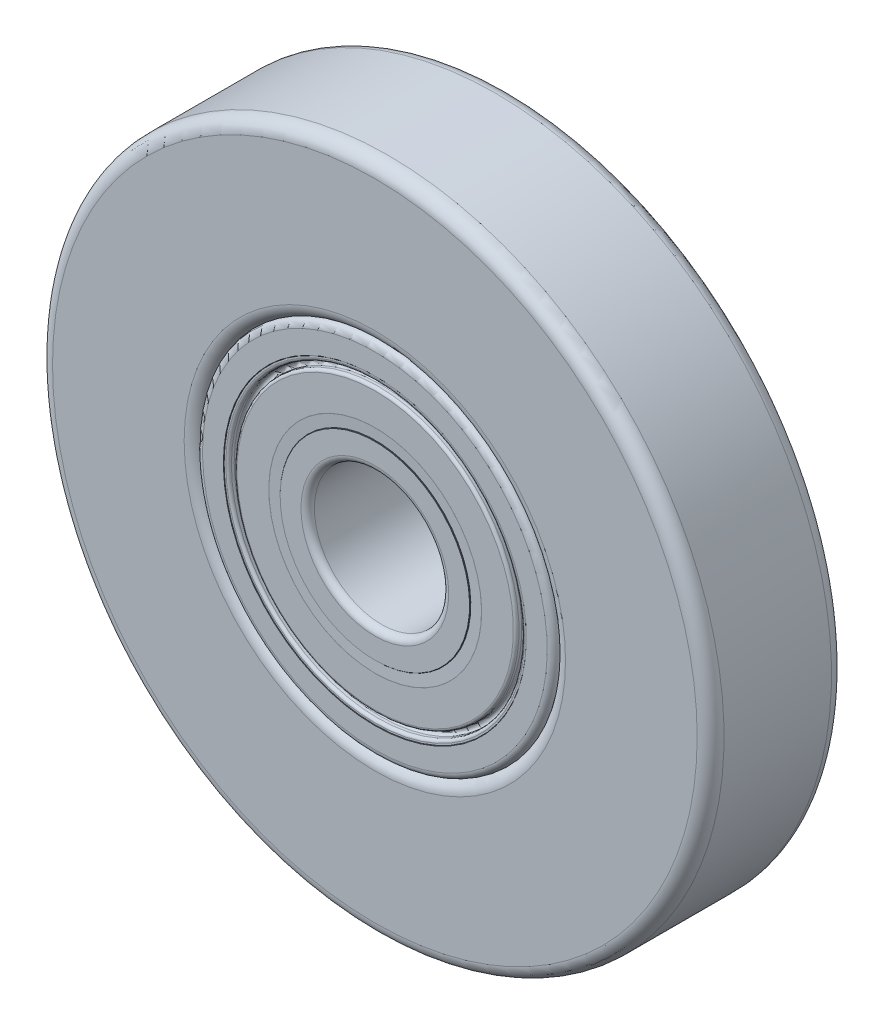
ISO-10303-21;
HEADER;
FILE_DESCRIPTION(('STEP AP214'),'2;1');
FILE_NAME('part.step','',(''),(''),'','','');
FILE_SCHEMA(('AUTOMOTIVE_DESIGN { 1 0 10303 214 1 1 1 1 }'));
ENDSEC;
DATA;
#1=APPLICATION_CONTEXT('core data for automotive mechanical design processes');
#2=APPLICATION_PROTOCOL_DEFINITION('international standard','automotive_design',2000,#1);
#3=PRODUCT_CONTEXT('',#1,'mechanical');
#4=PRODUCT('Part','Part','',(#3));
#5=PRODUCT_RELATED_PRODUCT_CATEGORY('part','',(#4));
#6=PRODUCT_DEFINITION_FORMATION('','',#4);
#7=PRODUCT_DEFINITION_CONTEXT('part definition',#1,'design');
#8=PRODUCT_DEFINITION('design','',#6,#7);
#9=PRODUCT_DEFINITION_SHAPE('','',#8);
#10=(LENGTH_UNIT() NAMED_UNIT(*) SI_UNIT(.MILLI.,.METRE.));
#11=(NAMED_UNIT(*) PLANE_ANGLE_UNIT() SI_UNIT($,.RADIAN.));
#12=(NAMED_UNIT(*) SI_UNIT($,.STERADIAN.) SOLID_ANGLE_UNIT());
#13=UNCERTAINTY_MEASURE_WITH_UNIT(LENGTH_MEASURE(1.E-05),#10,'distance_accuracy_value','');
#14=(GEOMETRIC_REPRESENTATION_CONTEXT(3) GLOBAL_UNCERTAINTY_ASSIGNED_CONTEXT((#13)) GLOBAL_UNIT_ASSIGNED_CONTEXT((#10,
#11,#12)) REPRESENTATION_CONTEXT('',''));
#15=CARTESIAN_POINT('',(0.,0.,0.));
#16=DIRECTION('',(0.,0.,1.));
#17=DIRECTION('',(1.,0.,0.));
#18=AXIS2_PLACEMENT_3D('',#15,#16,#17);
#19=CARTESIAN_POINT('',(0.,0.,8.89000000000002));
#20=DIRECTION('',(0.,0.,1.));
#21=DIRECTION('',(0.,-1.,0.));
#22=AXIS2_PLACEMENT_3D('',#19,#20,#21);
#23=CYLINDRICAL_SURFACE('',#22,2.12499999999995);
#24=CARTESIAN_POINT('',(0.,0.,1.492));
#25=DIRECTION('',(0.,0.,1.));
#26=DIRECTION('',(0.,-1.,0.));
#27=AXIS2_PLACEMENT_3D('',#24,#25,#26);
#28=CIRCLE('',#27,2.12499999999995);
#29=CARTESIAN_POINT('',(0.,-2.1249999999999,1.492));
#30=VERTEX_POINT('',#29);
#31=EDGE_CURVE('E69',#30,#30,#28,.T.);
#32=ORIENTED_EDGE('',*,*,#31,.F.);
#33=EDGE_LOOP('',(#32));
#34=FACE_BOUND('',#33,.T.);
#35=CARTESIAN_POINT('',(0.,0.,1.48102527812174));
#36=DIRECTION('',(0.,0.,1.));
#37=DIRECTION('',(0.,-1.,0.));
#38=AXIS2_PLACEMENT_3D('',#35,#36,#37);
#39=CIRCLE('',#38,2.12499999999995);
#40=CARTESIAN_POINT('',(0.,-2.1249999999999,1.48102527812174));
#41=VERTEX_POINT('',#40);
#42=EDGE_CURVE('E66',#41,#41,#39,.F.);
#43=ORIENTED_EDGE('',*,*,#42,.F.);
#44=EDGE_LOOP('',(#43));
#45=FACE_BOUND('',#44,.T.);
#46=ADVANCED_FACE('F43',(#34,#45),#23,.T.);
#47=CARTESIAN_POINT('',(0.,0.,-1.48102527812174));
#48=DIRECTION('',(0.,0.,1.));
#49=DIRECTION('',(0.,-1.,0.));
#50=AXIS2_PLACEMENT_3D('',#47,#48,#49);
#51=CIRCLE('',#50,2.12499999999995);
#52=CARTESIAN_POINT('',(0.,-2.1249999999999,-1.48102527812174));
#53=VERTEX_POINT('',#52);
#54=EDGE_CURVE('E144',#53,#53,#51,.T.);
#55=ORIENTED_EDGE('',*,*,#54,.F.);
#56=EDGE_LOOP('',(#55));
#57=FACE_BOUND('',#56,.T.);
#58=CARTESIAN_POINT('',(0.,0.,-1.492));
#59=DIRECTION('',(0.,0.,1.));
#60=DIRECTION('',(0.,-1.,0.));
#61=AXIS2_PLACEMENT_3D('',#58,#59,#60);
#62=CIRCLE('',#61,2.12499999999995);
#63=CARTESIAN_POINT('',(0.,-2.1249999999999,-1.492));
#64=VERTEX_POINT('',#63);
#65=EDGE_CURVE('E90',#64,#64,#62,.T.);
#66=ORIENTED_EDGE('',*,*,#65,.T.);
#67=EDGE_LOOP('',(#66));
#68=FACE_BOUND('',#67,.T.);
#69=ADVANCED_FACE('F193',(#57,#68),#23,.T.);
#70=CARTESIAN_POINT('',(0.,0.,1.492));
#71=DIRECTION('',(0.,0.,-1.));
#72=DIRECTION('',(0.,1.,0.));
#73=AXIS2_PLACEMENT_3D('',#70,#71,#72);
#74=CONICAL_SURFACE('',#73,2.12499999999995,0.785398163397503);
#75=CARTESIAN_POINT('',(0.,0.,1.5));
#76=DIRECTION('',(0.,0.,1.));
#77=DIRECTION('',(0.,-1.,0.));
#78=AXIS2_PLACEMENT_3D('',#75,#76,#77);
#79=CIRCLE('',#78,2.11699999999995);
#80=CARTESIAN_POINT('',(0.,-2.1169999999999,1.5));
#81=VERTEX_POINT('',#80);
#82=EDGE_CURVE('E72',#81,#81,#79,.T.);
#83=ORIENTED_EDGE('',*,*,#82,.F.);
#84=EDGE_LOOP('',(#83));
#85=FACE_BOUND('',#84,.T.);
#86=ORIENTED_EDGE('',*,*,#31,.T.);
#87=EDGE_LOOP('',(#86));
#88=FACE_BOUND('',#87,.T.);
#89=ADVANCED_FACE('F200',(#85,#88),#74,.T.);
#90=CARTESIAN_POINT('',(0.,2.117,1.5));
#91=DIRECTION('',(0.,0.,-1.));
#92=DIRECTION('',(0.,1.,0.));
#93=AXIS2_PLACEMENT_3D('',#90,#91,#92);
#94=PLANE('',#93);
#95=CARTESIAN_POINT('',(0.,0.,1.5));
#96=DIRECTION('',(0.,0.,1.));
#97=DIRECTION('',(0.,-1.,0.));
#98=AXIS2_PLACEMENT_3D('',#95,#96,#97);
#99=CIRCLE('',#98,1.64999999999995);
#100=CARTESIAN_POINT('',(0.,-1.64999999999991,1.5));
#101=VERTEX_POINT('',#100);
#102=EDGE_CURVE('E75',#101,#101,#99,.T.);
#103=ORIENTED_EDGE('',*,*,#102,.F.);
#104=EDGE_LOOP('',(#103));
#105=FACE_BOUND('',#104,.T.);
#106=ORIENTED_EDGE('',*,*,#82,.T.);
#107=EDGE_LOOP('',(#106));
#108=FACE_BOUND('',#107,.T.);
#109=ADVANCED_FACE('F319',(#105,#108),#94,.F.);
#110=CARTESIAN_POINT('',(0.,0.,1.35));
#111=DIRECTION('',(0.,0.,1.));
#112=DIRECTION('',(0.,-1.,0.));
#113=AXIS2_PLACEMENT_3D('',#110,#111,#112);
#114=TOROIDAL_SURFACE('',#113,1.64999999999995,0.150000000000001);
#115=CARTESIAN_POINT('',(0.,0.,1.35));
#116=DIRECTION('',(0.,0.,1.));
#117=DIRECTION('',(0.,-1.,0.));
#118=AXIS2_PLACEMENT_3D('',#115,#116,#117);
#119=CIRCLE('',#118,1.49999999999995);
#120=CARTESIAN_POINT('',(0.,-1.4999999999999,1.35));
#121=VERTEX_POINT('',#120);
#122=EDGE_CURVE('E78',#121,#121,#119,.T.);
#123=ORIENTED_EDGE('',*,*,#122,.F.);
#124=EDGE_LOOP('',(#123));
#125=FACE_BOUND('',#124,.T.);
#126=ORIENTED_EDGE('',*,*,#102,.T.);
#127=EDGE_LOOP('',(#126));
#128=FACE_BOUND('',#127,.T.);
#129=ADVANCED_FACE('F316',(#125,#128),#114,.T.);
#130=CARTESIAN_POINT('',(0.,0.,8.89000000000002));
#131=DIRECTION('',(0.,0.,1.));
#132=DIRECTION('',(0.,-1.,0.));
#133=AXIS2_PLACEMENT_3D('',#130,#131,#132);
#134=CYLINDRICAL_SURFACE('',#133,1.49999999999995);
#135=CARTESIAN_POINT('',(0.,0.,-1.35));
#136=DIRECTION('',(0.,0.,1.));
#137=DIRECTION('',(0.,-1.,0.));
#138=AXIS2_PLACEMENT_3D('',#135,#136,#137);
#139=CIRCLE('',#138,1.49999999999995);
#140=CARTESIAN_POINT('',(0.,-1.4999999999999,-1.35));
#141=VERTEX_POINT('',#140);
#142=EDGE_CURVE('E81',#141,#141,#139,.T.);
#143=ORIENTED_EDGE('',*,*,#142,.F.);
#144=EDGE_LOOP('',(#143));
#145=FACE_BOUND('',#144,.T.);
#146=ORIENTED_EDGE('',*,*,#122,.T.);
#147=EDGE_LOOP('',(#146));
#148=FACE_BOUND('',#147,.T.);
#149=ADVANCED_FACE('F312',(#145,#148),#134,.F.);
#150=CARTESIAN_POINT('',(0.,0.,-1.35));
#151=DIRECTION('',(0.,0.,1.));
#152=DIRECTION('',(0.,-1.,0.));
#153=AXIS2_PLACEMENT_3D('',#150,#151,#152);
#154=TOROIDAL_SURFACE('',#153,1.64999999999995,0.149999999999999);
#155=CARTESIAN_POINT('',(0.,0.,-1.5));
#156=DIRECTION('',(0.,0.,1.));
#157=DIRECTION('',(0.,-1.,0.));
#158=AXIS2_PLACEMENT_3D('',#155,#156,#157);
#159=CIRCLE('',#158,1.64999999999995);
#160=CARTESIAN_POINT('',(0.,-1.6499999999999,-1.5));
#161=VERTEX_POINT('',#160);
#162=EDGE_CURVE('E84',#161,#161,#159,.T.);
#163=ORIENTED_EDGE('',*,*,#162,.F.);
#164=EDGE_LOOP('',(#163));
#165=FACE_BOUND('',#164,.T.);
#166=ORIENTED_EDGE('',*,*,#142,.T.);
#167=EDGE_LOOP('',(#166));
#168=FACE_BOUND('',#167,.T.);
#169=ADVANCED_FACE('F308',(#165,#168),#154,.T.);
#170=CARTESIAN_POINT('',(0.,2.117,-1.5));
#171=DIRECTION('',(0.,0.,1.));
#172=DIRECTION('',(0.,-1.,0.));
#173=AXIS2_PLACEMENT_3D('',#170,#171,#172);
#174=PLANE('',#173);
#175=CARTESIAN_POINT('',(0.,0.,-1.5));
#176=DIRECTION('',(0.,0.,1.));
#177=DIRECTION('',(0.,-1.,0.));
#178=AXIS2_PLACEMENT_3D('',#175,#176,#177);
#179=CIRCLE('',#178,2.11699999999995);
#180=CARTESIAN_POINT('',(0.,-2.1169999999999,-1.5));
#181=VERTEX_POINT('',#180);
#182=EDGE_CURVE('E87',#181,#181,#179,.T.);
#183=ORIENTED_EDGE('',*,*,#182,.F.);
#184=EDGE_LOOP('',(#183));
#185=FACE_BOUND('',#184,.T.);
#186=ORIENTED_EDGE('',*,*,#162,.T.);
#187=EDGE_LOOP('',(#186));
#188=FACE_BOUND('',#187,.T.);
#189=ADVANCED_FACE('F304',(#185,#188),#174,.F.);
#190=CARTESIAN_POINT('',(0.,0.,-1.5));
#191=DIRECTION('',(0.,0.,1.));
#192=DIRECTION('',(0.,-1.,0.));
#193=AXIS2_PLACEMENT_3D('',#190,#191,#192);
#194=CONICAL_SURFACE('',#193,2.11699999999995,0.785398163397394);
#195=ORIENTED_EDGE('',*,*,#65,.F.);
#196=EDGE_LOOP('',(#195));
#197=FACE_BOUND('',#196,.T.);
#198=ORIENTED_EDGE('',*,*,#182,.T.);
#199=EDGE_LOOP('',(#198));
#200=FACE_BOUND('',#199,.T.);
#201=ADVANCED_FACE('F301',(#197,#200),#194,.T.);
#202=CARTESIAN_POINT('',(0.,0.,-1.49194051384887));
#203=DIRECTION('',(0.,0.,-1.));
#204=DIRECTION('',(0.,1.,0.));
#205=AXIS2_PLACEMENT_3D('',#202,#203,#204);
#206=CONICAL_SURFACE('',#205,2.37499999999995,1.52716309549504);
#207=ORIENTED_EDGE('',*,*,#54,.T.);
#208=EDGE_LOOP('',(#207));
#209=FACE_BOUND('',#208,.T.);
#210=CARTESIAN_POINT('',(0.,0.,-1.49194051384887));
#211=DIRECTION('',(0.,0.,1.));
#212=DIRECTION('',(0.,-1.,0.));
#213=AXIS2_PLACEMENT_3D('',#210,#211,#212);
#214=CIRCLE('',#213,2.37499999999995);
#215=CARTESIAN_POINT('',(0.,-2.3749999999999,-1.49194051384887));
#216=VERTEX_POINT('',#215);
#217=EDGE_CURVE('E93',#216,#216,#214,.T.);
#218=ORIENTED_EDGE('',*,*,#217,.F.);
#219=EDGE_LOOP('',(#218));
#220=FACE_BOUND('',#219,.T.);
#221=ADVANCED_FACE('F297',(#209,#220),#206,.F.);
#222=CARTESIAN_POINT('',(0.,0.,-1.4295));
#223=DIRECTION('',(0.,0.,1.));
#224=DIRECTION('',(0.,-1.,0.));
#225=AXIS2_PLACEMENT_3D('',#222,#223,#224);
#226=TOROIDAL_SURFACE('',#225,2.37772621171029,0.0625000000000003);
#227=CARTESIAN_POINT('',(0.,0.,-1.492));
#228=DIRECTION('',(0.,0.,1.));
#229=DIRECTION('',(0.,-1.,0.));
#230=AXIS2_PLACEMENT_3D('',#227,#228,#229);
#231=CIRCLE('',#230,2.37772621171029);
#232=CARTESIAN_POINT('',(0.,-2.37772621171024,-1.492));
#233=VERTEX_POINT('',#232);
#234=EDGE_CURVE('E96',#233,#233,#231,.T.);
#235=ORIENTED_EDGE('',*,*,#234,.F.);
#236=EDGE_LOOP('',(#235));
#237=FACE_BOUND('',#236,.T.);
#238=ORIENTED_EDGE('',*,*,#217,.T.);
#239=EDGE_LOOP('',(#238));
#240=FACE_BOUND('',#239,.T.);
#241=ADVANCED_FACE('F293',(#237,#240),#226,.T.);
#242=CARTESIAN_POINT('',(0.,0.,-1.492));
#243=DIRECTION('',(0.,0.,1.));
#244=DIRECTION('',(0.,-1.,0.));
#245=AXIS2_PLACEMENT_3D('',#242,#243,#244);
#246=PLANE('',#245);
#247=CARTESIAN_POINT('',(0.,0.,-1.492));
#248=DIRECTION('',(0.,0.,1.));
#249=DIRECTION('',(0.,-1.,0.));
#250=AXIS2_PLACEMENT_3D('',#247,#248,#249);
#251=CIRCLE('',#250,3.08749999999995);
#252=CARTESIAN_POINT('',(0.,-3.0874999999999,-1.492));
#253=VERTEX_POINT('',#252);
#254=EDGE_CURVE('E99',#253,#253,#251,.T.);
#255=ORIENTED_EDGE('',*,*,#254,.F.);
#256=EDGE_LOOP('',(#255));
#257=FACE_BOUND('',#256,.T.);
#258=ORIENTED_EDGE('',*,*,#234,.T.);
#259=EDGE_LOOP('',(#258));
#260=FACE_BOUND('',#259,.T.);
#261=ADVANCED_FACE('F289',(#257,#260),#246,.F.);
#262=CARTESIAN_POINT('',(0.,0.,-1.4295));
#263=DIRECTION('',(0.,0.,1.));
#264=DIRECTION('',(0.,-1.,0.));
#265=AXIS2_PLACEMENT_3D('',#262,#263,#264);
#266=TOROIDAL_SURFACE('',#265,3.08749999999995,0.0624999999999999);
#267=CARTESIAN_POINT('',(0.,0.,-1.4295));
#268=DIRECTION('',(0.,0.,1.));
#269=DIRECTION('',(0.,-1.,0.));
#270=AXIS2_PLACEMENT_3D('',#267,#268,#269);
#271=CIRCLE('',#270,3.14999999999995);
#272=CARTESIAN_POINT('',(0.,-3.1499999999999,-1.4295));
#273=VERTEX_POINT('',#272);
#274=EDGE_CURVE('E102',#273,#273,#271,.T.);
#275=ORIENTED_EDGE('',*,*,#274,.F.);
#276=EDGE_LOOP('',(#275));
#277=FACE_BOUND('',#276,.T.);
#278=ORIENTED_EDGE('',*,*,#254,.T.);
#279=EDGE_LOOP('',(#278));
#280=FACE_BOUND('',#279,.T.);
#281=ADVANCED_FACE('F285',(#277,#280),#266,.T.);
#282=CARTESIAN_POINT('',(0.,0.,8.89000000000002));
#283=DIRECTION('',(0.,0.,1.));
#284=DIRECTION('',(0.,-1.,0.));
#285=AXIS2_PLACEMENT_3D('',#282,#283,#284);
#286=CYLINDRICAL_SURFACE('',#285,3.14999999999995);
#287=CARTESIAN_POINT('',(0.,0.,-1.367));
#288=DIRECTION('',(0.,0.,1.));
#289=DIRECTION('',(0.,-1.,0.));
#290=AXIS2_PLACEMENT_3D('',#287,#288,#289);
#291=CIRCLE('',#290,3.14999999999995);
#292=CARTESIAN_POINT('',(0.,-3.1499999999999,-1.367));
#293=VERTEX_POINT('',#292);
#294=EDGE_CURVE('E105',#293,#293,#291,.T.);
#295=ORIENTED_EDGE('',*,*,#294,.F.);
#296=EDGE_LOOP('',(#295));
#297=FACE_BOUND('',#296,.T.);
#298=ORIENTED_EDGE('',*,*,#274,.T.);
#299=EDGE_LOOP('',(#298));
#300=FACE_BOUND('',#299,.T.);
#301=ADVANCED_FACE('F281',(#297,#300),#286,.T.);
#302=CARTESIAN_POINT('',(0.,0.,-1.367));
#303=DIRECTION('',(0.,0.,1.));
#304=DIRECTION('',(0.,-1.,0.));
#305=AXIS2_PLACEMENT_3D('',#302,#303,#304);
#306=TOROIDAL_SURFACE('',#305,3.21249999999995,0.0625000000000001);
#307=ORIENTED_EDGE('',*,*,#294,.T.);
#308=EDGE_LOOP('',(#307));
#309=FACE_BOUND('',#308,.T.);
#310=CARTESIAN_POINT('',(0.,0.,-1.367));
#311=DIRECTION('',(0.,0.,1.));
#312=DIRECTION('',(0.,-1.,0.));
#313=AXIS2_PLACEMENT_3D('',#310,#311,#312);
#314=CIRCLE('',#313,3.27499999999995);
#315=CARTESIAN_POINT('',(0.,-3.2749999999999,-1.367));
#316=VERTEX_POINT('',#315);
#317=EDGE_CURVE('E108',#316,#316,#314,.T.);
#318=ORIENTED_EDGE('',*,*,#317,.F.);
#319=EDGE_LOOP('',(#318));
#320=FACE_BOUND('',#319,.T.);
#321=ADVANCED_FACE('F277',(#309,#320),#306,.F.);
#322=CARTESIAN_POINT('',(0.,0.,8.89000000000002));
#323=DIRECTION('',(0.,0.,1.));
#324=DIRECTION('',(0.,-1.,0.));
#325=AXIS2_PLACEMENT_3D('',#322,#323,#324);
#326=CYLINDRICAL_SURFACE('',#325,3.27499999999995);
#327=ORIENTED_EDGE('',*,*,#317,.T.);
#328=EDGE_LOOP('',(#327));
#329=FACE_BOUND('',#328,.T.);
#330=CARTESIAN_POINT('',(0.,0.,-1.4295));
#331=DIRECTION('',(0.,0.,1.));
#332=DIRECTION('',(0.,-1.,0.));
#333=AXIS2_PLACEMENT_3D('',#330,#331,#332);
#334=CIRCLE('',#333,3.27499999999995);
#335=CARTESIAN_POINT('',(0.,-3.2749999999999,-1.4295));
#336=VERTEX_POINT('',#335);
#337=EDGE_CURVE('E111',#336,#336,#334,.T.);
#338=ORIENTED_EDGE('',*,*,#337,.F.);
#339=EDGE_LOOP('',(#338));
#340=FACE_BOUND('',#339,.T.);
#341=ADVANCED_FACE('F273',(#329,#340),#326,.F.);
#342=CARTESIAN_POINT('',(0.,0.,-1.4295));
#343=DIRECTION('',(0.,0.,1.));
#344=DIRECTION('',(0.,-1.,0.));
#345=AXIS2_PLACEMENT_3D('',#342,#343,#344);
#346=TOROIDAL_SURFACE('',#345,3.33749999999995,0.0624999999999993);
#347=CARTESIAN_POINT('',(0.,0.,-1.492));
#348=DIRECTION('',(0.,0.,1.));
#349=DIRECTION('',(0.,-1.,0.));
#350=AXIS2_PLACEMENT_3D('',#347,#348,#349);
#351=CIRCLE('',#350,3.33749999999995);
#352=CARTESIAN_POINT('',(0.,-3.3374999999999,-1.492));
#353=VERTEX_POINT('',#352);
#354=EDGE_CURVE('E114',#353,#353,#351,.T.);
#355=ORIENTED_EDGE('',*,*,#354,.F.);
#356=EDGE_LOOP('',(#355));
#357=FACE_BOUND('',#356,.T.);
#358=ORIENTED_EDGE('',*,*,#337,.T.);
#359=EDGE_LOOP('',(#358));
#360=FACE_BOUND('',#359,.T.);
#361=ADVANCED_FACE('F269',(#357,#360),#346,.T.);
#362=CARTESIAN_POINT('',(0.,0.,-1.492));
#363=DIRECTION('',(0.,0.,-1.));
#364=DIRECTION('',(0.,1.,0.));
#365=AXIS2_PLACEMENT_3D('',#362,#363,#364);
#366=PLANE('',#365);
#367=ORIENTED_EDGE('',*,*,#354,.T.);
#368=EDGE_LOOP('',(#367));
#369=FACE_BOUND('',#368,.T.);
#370=CARTESIAN_POINT('',(0.,0.,-1.492));
#371=DIRECTION('',(0.,0.,1.));
#372=DIRECTION('',(0.,-1.,0.));
#373=AXIS2_PLACEMENT_3D('',#370,#371,#372);
#374=CIRCLE('',#373,3.37499999999995);
#375=CARTESIAN_POINT('',(0.,-3.3749999999999,-1.492));
#376=VERTEX_POINT('',#375);
#377=EDGE_CURVE('E117',#376,#376,#374,.T.);
#378=ORIENTED_EDGE('',*,*,#377,.F.);
#379=EDGE_LOOP('',(#378));
#380=FACE_BOUND('',#379,.T.);
#381=ADVANCED_FACE('F265',(#369,#380),#366,.T.);
#382=CARTESIAN_POINT('',(0.,1.72547161743874E-13,1.492));
#383=DIRECTION('',(0.,0.,-1.));
#384=DIRECTION('',(0.,1.,0.));
#385=AXIS2_PLACEMENT_3D('',#382,#383,#384);
#386=PLANE('',#385);
#387=CARTESIAN_POINT('',(0.,0.,1.492));
#388=DIRECTION('',(0.,0.,1.));
#389=DIRECTION('',(0.,-1.,0.));
#390=AXIS2_PLACEMENT_3D('',#387,#388,#389);
#391=CIRCLE('',#390,3.33749999999995);
#392=CARTESIAN_POINT('',(0.,-3.3374999999999,1.492));
#393=VERTEX_POINT('',#392);
#394=EDGE_CURVE('E120',#393,#393,#391,.T.);
#395=ORIENTED_EDGE('',*,*,#394,.F.);
#396=EDGE_LOOP('',(#395));
#397=FACE_BOUND('',#396,.T.);
#398=CARTESIAN_POINT('',(0.,0.,1.49199999999999));
#399=DIRECTION('',(0.,0.,1.));
#400=DIRECTION('',(0.,-1.,0.));
#401=AXIS2_PLACEMENT_3D('',#398,#399,#400);
#402=CIRCLE('',#401,3.37499999999995);
#403=CARTESIAN_POINT('',(0.,-3.3749999999999,1.49199999999999));
#404=VERTEX_POINT('',#403);
#405=EDGE_CURVE('E153',#404,#404,#402,.T.);
#406=ORIENTED_EDGE('',*,*,#405,.T.);
#407=EDGE_LOOP('',(#406));
#408=FACE_BOUND('',#407,.T.);
#409=ADVANCED_FACE('F261',(#397,#408),#386,.F.);
#410=CARTESIAN_POINT('',(0.,0.,1.4295));
#411=DIRECTION('',(0.,0.,1.));
#412=DIRECTION('',(0.,-1.,0.));
#413=AXIS2_PLACEMENT_3D('',#410,#411,#412);
#414=TOROIDAL_SURFACE('',#413,3.33749999999995,0.0624999999999999);
#415=CARTESIAN_POINT('',(0.,0.,1.4295));
#416=DIRECTION('',(0.,0.,1.));
#417=DIRECTION('',(0.,-1.,0.));
#418=AXIS2_PLACEMENT_3D('',#415,#416,#417);
#419=CIRCLE('',#418,3.27499999999995);
#420=CARTESIAN_POINT('',(0.,-3.2749999999999,1.4295));
#421=VERTEX_POINT('',#420);
#422=EDGE_CURVE('E123',#421,#421,#419,.T.);
#423=ORIENTED_EDGE('',*,*,#422,.F.);
#424=EDGE_LOOP('',(#423));
#425=FACE_BOUND('',#424,.T.);
#426=ORIENTED_EDGE('',*,*,#394,.T.);
#427=EDGE_LOOP('',(#426));
#428=FACE_BOUND('',#427,.T.);
#429=ADVANCED_FACE('F257',(#425,#428),#414,.T.);
#430=CARTESIAN_POINT('',(0.,0.,8.89000000000002));
#431=DIRECTION('',(0.,0.,1.));
#432=DIRECTION('',(0.,-1.,0.));
#433=AXIS2_PLACEMENT_3D('',#430,#431,#432);
#434=CYLINDRICAL_SURFACE('',#433,3.27499999999995);
#435=CARTESIAN_POINT('',(0.,0.,1.367));
#436=DIRECTION('',(0.,0.,1.));
#437=DIRECTION('',(0.,-1.,0.));
#438=AXIS2_PLACEMENT_3D('',#435,#436,#437);
#439=CIRCLE('',#438,3.27499999999995);
#440=CARTESIAN_POINT('',(0.,-3.2749999999999,1.367));
#441=VERTEX_POINT('',#440);
#442=EDGE_CURVE('E126',#441,#441,#439,.T.);
#443=ORIENTED_EDGE('',*,*,#442,.F.);
#444=EDGE_LOOP('',(#443));
#445=FACE_BOUND('',#444,.T.);
#446=ORIENTED_EDGE('',*,*,#422,.T.);
#447=EDGE_LOOP('',(#446));
#448=FACE_BOUND('',#447,.T.);
#449=ADVANCED_FACE('F253',(#445,#448),#434,.F.);
#450=CARTESIAN_POINT('',(0.,0.,1.367));
#451=DIRECTION('',(0.,0.,1.));
#452=DIRECTION('',(0.,-1.,0.));
#453=AXIS2_PLACEMENT_3D('',#450,#451,#452);
#454=TOROIDAL_SURFACE('',#453,3.21249999999995,0.0625000000000001);
#455=ORIENTED_EDGE('',*,*,#442,.T.);
#456=EDGE_LOOP('',(#455));
#457=FACE_BOUND('',#456,.T.);
#458=CARTESIAN_POINT('',(0.,0.,1.367));
#459=DIRECTION('',(0.,0.,1.));
#460=DIRECTION('',(0.,-1.,0.));
#461=AXIS2_PLACEMENT_3D('',#458,#459,#460);
#462=CIRCLE('',#461,3.14999999999995);
#463=CARTESIAN_POINT('',(0.,-3.1499999999999,1.367));
#464=VERTEX_POINT('',#463);
#465=EDGE_CURVE('E129',#464,#464,#462,.T.);
#466=ORIENTED_EDGE('',*,*,#465,.F.);
#467=EDGE_LOOP('',(#466));
#468=FACE_BOUND('',#467,.T.);
#469=ADVANCED_FACE('F249',(#457,#468),#454,.F.);
#470=CARTESIAN_POINT('',(0.,0.,8.89000000000002));
#471=DIRECTION('',(0.,0.,1.));
#472=DIRECTION('',(0.,-1.,0.));
#473=AXIS2_PLACEMENT_3D('',#470,#471,#472);
#474=CYLINDRICAL_SURFACE('',#473,3.14999999999995);
#475=ORIENTED_EDGE('',*,*,#465,.T.);
#476=EDGE_LOOP('',(#475));
#477=FACE_BOUND('',#476,.T.);
#478=CARTESIAN_POINT('',(0.,0.,1.4295));
#479=DIRECTION('',(0.,0.,1.));
#480=DIRECTION('',(0.,-1.,0.));
#481=AXIS2_PLACEMENT_3D('',#478,#479,#480);
#482=CIRCLE('',#481,3.14999999999995);
#483=CARTESIAN_POINT('',(0.,-3.1499999999999,1.4295));
#484=VERTEX_POINT('',#483);
#485=EDGE_CURVE('E132',#484,#484,#482,.T.);
#486=ORIENTED_EDGE('',*,*,#485,.F.);
#487=EDGE_LOOP('',(#486));
#488=FACE_BOUND('',#487,.T.);
#489=ADVANCED_FACE('F245',(#477,#488),#474,.T.);
#490=CARTESIAN_POINT('',(0.,0.,1.4295));
#491=DIRECTION('',(0.,0.,1.));
#492=DIRECTION('',(0.,-1.,0.));
#493=AXIS2_PLACEMENT_3D('',#490,#491,#492);
#494=TOROIDAL_SURFACE('',#493,3.08749999999995,0.0624999999999996);
#495=CARTESIAN_POINT('',(0.,0.,1.492));
#496=DIRECTION('',(0.,0.,1.));
#497=DIRECTION('',(0.,-1.,0.));
#498=AXIS2_PLACEMENT_3D('',#495,#496,#497);
#499=CIRCLE('',#498,3.08749999999995);
#500=CARTESIAN_POINT('',(0.,-3.08749999999991,1.492));
#501=VERTEX_POINT('',#500);
#502=EDGE_CURVE('E135',#501,#501,#499,.T.);
#503=ORIENTED_EDGE('',*,*,#502,.F.);
#504=EDGE_LOOP('',(#503));
#505=FACE_BOUND('',#504,.T.);
#506=ORIENTED_EDGE('',*,*,#485,.T.);
#507=EDGE_LOOP('',(#506));
#508=FACE_BOUND('',#507,.T.);
#509=ADVANCED_FACE('F241',(#505,#508),#494,.T.);
#510=CARTESIAN_POINT('',(0.,0.,1.492));
#511=DIRECTION('',(0.,0.,1.));
#512=DIRECTION('',(0.,-1.,0.));
#513=AXIS2_PLACEMENT_3D('',#510,#511,#512);
#514=PLANE('',#513);
#515=ORIENTED_EDGE('',*,*,#502,.T.);
#516=EDGE_LOOP('',(#515));
#517=FACE_BOUND('',#516,.T.);
#518=CARTESIAN_POINT('',(0.,0.,1.492));
#519=DIRECTION('',(0.,0.,1.));
#520=DIRECTION('',(0.,-1.,0.));
#521=AXIS2_PLACEMENT_3D('',#518,#519,#520);
#522=CIRCLE('',#521,2.37772621171029);
#523=CARTESIAN_POINT('',(0.,-2.37772621171024,1.492));
#524=VERTEX_POINT('',#523);
#525=EDGE_CURVE('E138',#524,#524,#522,.T.);
#526=ORIENTED_EDGE('',*,*,#525,.F.);
#527=EDGE_LOOP('',(#526));
#528=FACE_BOUND('',#527,.T.);
#529=ADVANCED_FACE('F237',(#517,#528),#514,.T.);
#530=CARTESIAN_POINT('',(0.,0.,1.4295));
#531=DIRECTION('',(0.,0.,1.));
#532=DIRECTION('',(0.,-1.,0.));
#533=AXIS2_PLACEMENT_3D('',#530,#531,#532);
#534=TOROIDAL_SURFACE('',#533,2.37772621171029,0.0624999999999996);
#535=CARTESIAN_POINT('',(0.,0.,1.49194051384886));
#536=DIRECTION('',(0.,0.,1.));
#537=DIRECTION('',(0.,-1.,0.));
#538=AXIS2_PLACEMENT_3D('',#535,#536,#537);
#539=CIRCLE('',#538,2.37499999999995);
#540=CARTESIAN_POINT('',(0.,-2.37499999999991,1.49194051384886));
#541=VERTEX_POINT('',#540);
#542=EDGE_CURVE('E141',#541,#541,#539,.T.);
#543=ORIENTED_EDGE('',*,*,#542,.F.);
#544=EDGE_LOOP('',(#543));
#545=FACE_BOUND('',#544,.T.);
#546=ORIENTED_EDGE('',*,*,#525,.T.);
#547=EDGE_LOOP('',(#546));
#548=FACE_BOUND('',#547,.T.);
#549=ADVANCED_FACE('F229',(#545,#548),#534,.T.);
#550=CARTESIAN_POINT('',(0.,0.,1.49194051384886));
#551=DIRECTION('',(0.,0.,1.));
#552=DIRECTION('',(0.,-1.,0.));
#553=AXIS2_PLACEMENT_3D('',#550,#551,#552);
#554=CONICAL_SURFACE('',#553,2.37499999999995,1.52716309549505);
#555=ORIENTED_EDGE('',*,*,#42,.T.);
#556=EDGE_LOOP('',(#555));
#557=FACE_BOUND('',#556,.T.);
#558=ORIENTED_EDGE('',*,*,#542,.T.);
#559=EDGE_LOOP('',(#558));
#560=FACE_BOUND('',#559,.T.);
#561=ADVANCED_FACE('F218',(#557,#560),#554,.F.);
#562=CARTESIAN_POINT('',(0.,0.,1.35));
#563=DIRECTION('',(0.,0.,1.));
#564=DIRECTION('',(0.,-1.,0.));
#565=AXIS2_PLACEMENT_3D('',#562,#563,#564);
#566=TOROIDAL_SURFACE('',#565,3.84999999999995,0.15);
#567=CARTESIAN_POINT('',(0.,0.,1.5));
#568=DIRECTION('',(0.,0.,1.));
#569=DIRECTION('',(0.,-1.,0.));
#570=AXIS2_PLACEMENT_3D('',#567,#568,#569);
#571=CIRCLE('',#570,3.84999999999995);
#572=CARTESIAN_POINT('',(0.,-3.8499999999999,1.5));
#573=VERTEX_POINT('',#572);
#574=EDGE_CURVE('E147',#573,#573,#571,.T.);
#575=ORIENTED_EDGE('',*,*,#574,.F.);
#576=EDGE_LOOP('',(#575));
#577=FACE_BOUND('',#576,.T.);
#578=CARTESIAN_POINT('',(0.,0.,1.35));
#579=DIRECTION('',(0.,0.,-1.));
#580=DIRECTION('',(-1.,0.,0.));
#581=AXIS2_PLACEMENT_3D('',#578,#579,#580);
#582=CIRCLE('',#581,3.99999999999995);
#583=CARTESIAN_POINT('',(-3.99999999999995,0.,1.35));
#584=VERTEX_POINT('',#583);
#585=EDGE_CURVE('E165',#584,#584,#582,.F.);
#586=ORIENTED_EDGE('',*,*,#585,.T.);
#587=EDGE_LOOP('',(#586));
#588=FACE_BOUND('',#587,.T.);
#589=ADVANCED_FACE('F215',(#577,#588),#566,.T.);
#590=CARTESIAN_POINT('',(0.,3.85,1.5));
#591=DIRECTION('',(0.,0.,-1.));
#592=DIRECTION('',(0.,1.,0.));
#593=AXIS2_PLACEMENT_3D('',#590,#591,#592);
#594=PLANE('',#593);
#595=CARTESIAN_POINT('',(0.,0.,1.5));
#596=DIRECTION('',(0.,0.,1.));
#597=DIRECTION('',(0.,-1.,0.));
#598=AXIS2_PLACEMENT_3D('',#595,#596,#597);
#599=CIRCLE('',#598,3.38299999999995);
#600=CARTESIAN_POINT('',(0.,-3.38299999999991,1.5));
#601=VERTEX_POINT('',#600);
#602=EDGE_CURVE('E150',#601,#601,#599,.T.);
#603=ORIENTED_EDGE('',*,*,#602,.F.);
#604=EDGE_LOOP('',(#603));
#605=FACE_BOUND('',#604,.T.);
#606=ORIENTED_EDGE('',*,*,#574,.T.);
#607=EDGE_LOOP('',(#606));
#608=FACE_BOUND('',#607,.T.);
#609=ADVANCED_FACE('F217',(#605,#608),#594,.F.);
#610=CARTESIAN_POINT('',(0.,0.,1.5));
#611=DIRECTION('',(0.,0.,1.));
#612=DIRECTION('',(0.,-1.,0.));
#613=AXIS2_PLACEMENT_3D('',#610,#611,#612);
#614=CONICAL_SURFACE('',#613,3.38299999999995,0.78539816339734);
#615=ORIENTED_EDGE('',*,*,#405,.F.);
#616=EDGE_LOOP('',(#615));
#617=FACE_BOUND('',#616,.T.);
#618=ORIENTED_EDGE('',*,*,#602,.T.);
#619=EDGE_LOOP('',(#618));
#620=FACE_BOUND('',#619,.T.);
#621=ADVANCED_FACE('F225',(#617,#620),#614,.F.);
#622=CARTESIAN_POINT('',(0.,0.,-1.492));
#623=DIRECTION('',(0.,0.,-1.));
#624=DIRECTION('',(0.,1.,0.));
#625=AXIS2_PLACEMENT_3D('',#622,#623,#624);
#626=CONICAL_SURFACE('',#625,3.37499999999995,0.785398163397286);
#627=CARTESIAN_POINT('',(0.,0.,-1.5));
#628=DIRECTION('',(0.,0.,1.));
#629=DIRECTION('',(0.,-1.,0.));
#630=AXIS2_PLACEMENT_3D('',#627,#628,#629);
#631=CIRCLE('',#630,3.38299999999995);
#632=CARTESIAN_POINT('',(0.,-3.3829999999999,-1.5));
#633=VERTEX_POINT('',#632);
#634=EDGE_CURVE('E156',#633,#633,#631,.T.);
#635=ORIENTED_EDGE('',*,*,#634,.F.);
#636=EDGE_LOOP('',(#635));
#637=FACE_BOUND('',#636,.T.);
#638=ORIENTED_EDGE('',*,*,#377,.T.);
#639=EDGE_LOOP('',(#638));
#640=FACE_BOUND('',#639,.T.);
#641=ADVANCED_FACE('F502',(#637,#640),#626,.F.);
#642=CARTESIAN_POINT('',(0.,3.85,-1.5));
#643=DIRECTION('',(0.,0.,1.));
#644=DIRECTION('',(0.,-1.,0.));
#645=AXIS2_PLACEMENT_3D('',#642,#643,#644);
#646=PLANE('',#645);
#647=CARTESIAN_POINT('',(0.,0.,-1.5));
#648=DIRECTION('',(0.,0.,1.));
#649=DIRECTION('',(0.,-1.,0.));
#650=AXIS2_PLACEMENT_3D('',#647,#648,#649);
#651=CIRCLE('',#650,3.84999999999995);
#652=CARTESIAN_POINT('',(0.,-3.8499999999999,-1.5));
#653=VERTEX_POINT('',#652);
#654=EDGE_CURVE('E159',#653,#653,#651,.T.);
#655=ORIENTED_EDGE('',*,*,#654,.F.);
#656=EDGE_LOOP('',(#655));
#657=FACE_BOUND('',#656,.T.);
#658=ORIENTED_EDGE('',*,*,#634,.T.);
#659=EDGE_LOOP('',(#658));
#660=FACE_BOUND('',#659,.T.);
#661=ADVANCED_FACE('F510',(#657,#660),#646,.F.);
#662=CARTESIAN_POINT('',(0.,0.,-1.35));
#663=DIRECTION('',(0.,0.,1.));
#664=DIRECTION('',(0.,-1.,0.));
#665=AXIS2_PLACEMENT_3D('',#662,#663,#664);
#666=TOROIDAL_SURFACE('',#665,3.84999999999995,0.150000000000001);
#667=CARTESIAN_POINT('',(0.,0.,-1.35));
#668=DIRECTION('',(0.,0.,1.));
#669=DIRECTION('',(0.,-1.,0.));
#670=AXIS2_PLACEMENT_3D('',#667,#668,#669);
#671=CIRCLE('',#670,3.99999999999995);
#672=CARTESIAN_POINT('',(0.,-3.9999999999999,-1.35));
#673=VERTEX_POINT('',#672);
#674=EDGE_CURVE('E162',#673,#673,#671,.T.);
#675=ORIENTED_EDGE('',*,*,#674,.F.);
#676=EDGE_LOOP('',(#675));
#677=FACE_BOUND('',#676,.T.);
#678=ORIENTED_EDGE('',*,*,#654,.T.);
#679=EDGE_LOOP('',(#678));
#680=FACE_BOUND('',#679,.T.);
#681=ADVANCED_FACE('F519',(#677,#680),#666,.T.);
#682=CARTESIAN_POINT('',(0.,0.,1.5));
#683=DIRECTION('',(0.,0.,1.));
#684=DIRECTION('',(0.,-1.,0.));
#685=AXIS2_PLACEMENT_3D('',#682,#683,#684);
#686=PLANE('',#685);
#687=CARTESIAN_POINT('',(0.,0.,1.5));
#688=DIRECTION('',(0.,0.,1.));
#689=DIRECTION('',(0.,-1.,0.));
#690=AXIS2_PLACEMENT_3D('',#687,#688,#689);
#691=CIRCLE('',#690,4.25980762113528);
#692=CARTESIAN_POINT('',(0.,-4.25980762113524,1.5));
#693=VERTEX_POINT('',#692);
#694=EDGE_CURVE('E10',#693,#693,#691,.F.);
#695=ORIENTED_EDGE('',*,*,#694,.T.);
#696=EDGE_LOOP('',(#695));
#697=FACE_BOUND('',#696,.T.);
#698=CARTESIAN_POINT('',(0.,0.,1.5));
#699=DIRECTION('',(0.,0.,1.));
#700=DIRECTION('',(0.,-1.,0.));
#701=AXIS2_PLACEMENT_3D('',#698,#699,#700);
#702=CIRCLE('',#701,7.2);
#703=CARTESIAN_POINT('',(0.,-7.19999999999995,1.5));
#704=VERTEX_POINT('',#703);
#705=EDGE_CURVE('E50',#704,#704,#702,.T.);
#706=ORIENTED_EDGE('',*,*,#705,.T.);
#707=EDGE_LOOP('',(#706));
#708=FACE_BOUND('',#707,.T.);
#709=ADVANCED_FACE('F527',(#697,#708),#686,.T.);
#710=CARTESIAN_POINT('',(0.,0.,-1.5));
#711=DIRECTION('',(0.,0.,1.));
#712=DIRECTION('',(0.,-1.,0.));
#713=AXIS2_PLACEMENT_3D('',#710,#711,#712);
#714=PLANE('',#713);
#715=CARTESIAN_POINT('',(0.,0.,-1.5));
#716=DIRECTION('',(0.,0.,1.));
#717=DIRECTION('',(0.,-1.,0.));
#718=AXIS2_PLACEMENT_3D('',#715,#716,#717);
#719=CIRCLE('',#718,7.2);
#720=CARTESIAN_POINT('',(0.,-7.19999999999995,-1.5));
#721=VERTEX_POINT('',#720);
#722=EDGE_CURVE('E54',#721,#721,#719,.F.);
#723=ORIENTED_EDGE('',*,*,#722,.T.);
#724=EDGE_LOOP('',(#723));
#725=FACE_BOUND('',#724,.T.);
#726=CARTESIAN_POINT('',(0.,0.,-1.5));
#727=DIRECTION('',(0.,0.,1.));
#728=DIRECTION('',(0.,-1.,0.));
#729=AXIS2_PLACEMENT_3D('',#726,#727,#728);
#730=CIRCLE('',#729,3.99999999999995);
#731=CARTESIAN_POINT('',(0.,-3.9999999999999,-1.5));
#732=VERTEX_POINT('',#731);
#733=EDGE_CURVE('E168',#732,#732,#730,.T.);
#734=ORIENTED_EDGE('',*,*,#733,.T.);
#735=EDGE_LOOP('',(#734));
#736=FACE_BOUND('',#735,.T.);
#737=ADVANCED_FACE('F172',(#725,#736),#714,.F.);
#738=CARTESIAN_POINT('',(0.,0.,1.5));
#739=DIRECTION('',(0.,0.,-1.));
#740=DIRECTION('',(-1.,0.,0.));
#741=AXIS2_PLACEMENT_3D('',#738,#739,#740);
#742=CYLINDRICAL_SURFACE('',#741,7.5);
#743=CARTESIAN_POINT('',(0.,0.,-1.2));
#744=DIRECTION('',(0.,0.,1.));
#745=DIRECTION('',(0.,-1.,0.));
#746=AXIS2_PLACEMENT_3D('',#743,#744,#745);
#747=CIRCLE('',#746,7.5);
#748=CARTESIAN_POINT('',(0.,-7.49999999999995,-1.2));
#749=VERTEX_POINT('',#748);
#750=EDGE_CURVE('E58',#749,#749,#747,.T.);
#751=ORIENTED_EDGE('',*,*,#750,.T.);
#752=EDGE_LOOP('',(#751));
#753=FACE_BOUND('',#752,.T.);
#754=CARTESIAN_POINT('',(0.,0.,1.2));
#755=DIRECTION('',(0.,0.,1.));
#756=DIRECTION('',(0.,-1.,0.));
#757=AXIS2_PLACEMENT_3D('',#754,#755,#756);
#758=CIRCLE('',#757,7.5);
#759=CARTESIAN_POINT('',(0.,-7.49999999999995,1.2));
#760=VERTEX_POINT('',#759);
#761=EDGE_CURVE('E63',#760,#760,#758,.F.);
#762=ORIENTED_EDGE('',*,*,#761,.T.);
#763=EDGE_LOOP('',(#762));
#764=FACE_BOUND('',#763,.T.);
#765=ADVANCED_FACE('F177',(#753,#764),#742,.T.);
#766=CARTESIAN_POINT('',(0.,0.,1.5));
#767=DIRECTION('',(0.,0.,-1.));
#768=DIRECTION('',(-1.,0.,0.));
#769=AXIS2_PLACEMENT_3D('',#766,#767,#768);
#770=CYLINDRICAL_SURFACE('',#769,3.99999999999995);
#771=ORIENTED_EDGE('',*,*,#674,.T.);
#772=EDGE_LOOP('',(#771));
#773=FACE_BOUND('',#772,.T.);
#774=ORIENTED_EDGE('',*,*,#733,.F.);
#775=EDGE_LOOP('',(#774));
#776=FACE_BOUND('',#775,.T.);
#777=ADVANCED_FACE('F174',(#773,#776),#770,.F.);
#778=CARTESIAN_POINT('',(0.,0.,-1.2));
#779=DIRECTION('',(0.,0.,1.));
#780=DIRECTION('',(0.,-1.,0.));
#781=AXIS2_PLACEMENT_3D('',#778,#779,#780);
#782=TOROIDAL_SURFACE('',#781,7.2,0.3);
#783=ORIENTED_EDGE('',*,*,#722,.F.);
#784=EDGE_LOOP('',(#783));
#785=FACE_BOUND('',#784,.T.);
#786=ORIENTED_EDGE('',*,*,#750,.F.);
#787=EDGE_LOOP('',(#786));
#788=FACE_BOUND('',#787,.T.);
#789=ADVANCED_FACE('F176',(#785,#788),#782,.T.);
#790=CARTESIAN_POINT('',(0.,0.,1.2));
#791=DIRECTION('',(0.,0.,1.));
#792=DIRECTION('',(0.,-1.,0.));
#793=AXIS2_PLACEMENT_3D('',#790,#791,#792);
#794=TOROIDAL_SURFACE('',#793,4.25980762113528,0.3);
#795=ORIENTED_EDGE('',*,*,#694,.F.);
#796=EDGE_LOOP('',(#795));
#797=FACE_BOUND('',#796,.T.);
#798=ORIENTED_EDGE('',*,*,#585,.F.);
#799=EDGE_LOOP('',(#798));
#800=FACE_BOUND('',#799,.T.);
#801=ADVANCED_FACE('F185',(#797,#800),#794,.T.);
#802=CARTESIAN_POINT('',(0.,0.,1.2));
#803=DIRECTION('',(0.,0.,1.));
#804=DIRECTION('',(0.,-1.,0.));
#805=AXIS2_PLACEMENT_3D('',#802,#803,#804);
#806=TOROIDAL_SURFACE('',#805,7.2,0.3);
#807=ORIENTED_EDGE('',*,*,#761,.F.);
#808=EDGE_LOOP('',(#807));
#809=FACE_BOUND('',#808,.T.);
#810=ORIENTED_EDGE('',*,*,#705,.F.);
#811=EDGE_LOOP('',(#810));
#812=FACE_BOUND('',#811,.T.);
#813=ADVANCED_FACE('F45',(#809,#812),#806,.T.);
#814=CLOSED_SHELL('',(#46,#69,#89,#109,#129,#149,#169,#189,#201,#221,#241,#261,#281,#301,#321,
#341,#361,#381,#409,#429,#449,#469,#489,#509,#529,#549,#561,#589,#609,#621,#641,#661,#681,#709,
#737,#765,#777,#789,#801,#813));
#815=MANIFOLD_SOLID_BREP('B2',#814);
#816=ADVANCED_BREP_SHAPE_REPRESENTATION('',(#18,#815),#14);
#817=SHAPE_DEFINITION_REPRESENTATION(#9,#816);
ENDSEC;
END-ISO-10303-21;
